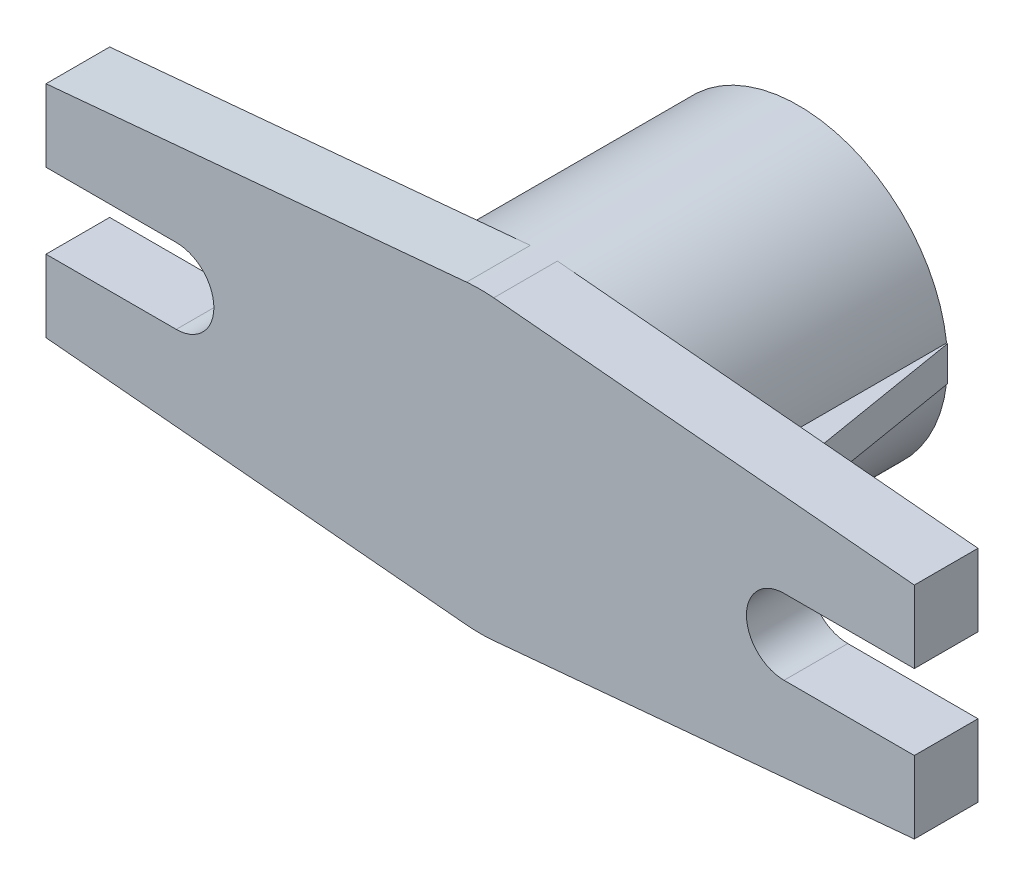
ISO-10303-21;
HEADER;
FILE_DESCRIPTION(('STEP AP214'),'2;1');
FILE_NAME('part.step','',(''),(''),'','','');
FILE_SCHEMA(('AUTOMOTIVE_DESIGN { 1 0 10303 214 1 1 1 1 }'));
ENDSEC;
DATA;
#1=APPLICATION_CONTEXT('core data for automotive mechanical design processes');
#2=APPLICATION_PROTOCOL_DEFINITION('international standard','automotive_design',2000,#1);
#3=PRODUCT_CONTEXT('',#1,'mechanical');
#4=PRODUCT('Part','Part','',(#3));
#5=PRODUCT_RELATED_PRODUCT_CATEGORY('part','',(#4));
#6=PRODUCT_DEFINITION_FORMATION('','',#4);
#7=PRODUCT_DEFINITION_CONTEXT('part definition',#1,'design');
#8=PRODUCT_DEFINITION('design','',#6,#7);
#9=PRODUCT_DEFINITION_SHAPE('','',#8);
#10=(LENGTH_UNIT() NAMED_UNIT(*) SI_UNIT(.MILLI.,.METRE.));
#11=(NAMED_UNIT(*) PLANE_ANGLE_UNIT() SI_UNIT($,.RADIAN.));
#12=(NAMED_UNIT(*) SI_UNIT($,.STERADIAN.) SOLID_ANGLE_UNIT());
#13=UNCERTAINTY_MEASURE_WITH_UNIT(LENGTH_MEASURE(1.E-05),#10,'distance_accuracy_value','');
#14=(GEOMETRIC_REPRESENTATION_CONTEXT(3) GLOBAL_UNCERTAINTY_ASSIGNED_CONTEXT((#13)) GLOBAL_UNIT_ASSIGNED_CONTEXT((#10,
#11,#12)) REPRESENTATION_CONTEXT('',''));
#15=CARTESIAN_POINT('',(0.,0.,0.));
#16=DIRECTION('',(0.,0.,1.));
#17=DIRECTION('',(1.,0.,0.));
#18=AXIS2_PLACEMENT_3D('',#15,#16,#17);
#19=CARTESIAN_POINT('',(0.,0.,110.));
#20=DIRECTION('',(0.,0.,-1.));
#21=DIRECTION('',(-1.,0.,0.));
#22=AXIS2_PLACEMENT_3D('',#19,#20,#21);
#23=CYLINDRICAL_SURFACE('',#22,51.5);
#24=DIRECTION('',(0.,0.,-1.));
#25=VECTOR('',#24,1.);
#26=CARTESIAN_POINT('',(-51.149291295188,-6.,110.));
#27=LINE('',#26,#25);
#28=CARTESIAN_POINT('',(-51.149291295188,-6.,0.));
#29=VERTEX_POINT('',#28);
#30=CARTESIAN_POINT('',(-51.149291295188,-6.,88.));
#31=VERTEX_POINT('',#30);
#32=EDGE_CURVE('E48',#29,#31,#27,.F.);
#33=ORIENTED_EDGE('',*,*,#32,.F.);
#34=CARTESIAN_POINT('',(0.,0.,0.));
#35=DIRECTION('',(0.,0.,1.));
#36=DIRECTION('',(1.,0.,0.));
#37=AXIS2_PLACEMENT_3D('',#34,#35,#36);
#38=CIRCLE('',#37,51.5);
#39=CARTESIAN_POINT('',(51.149291295188,-6.,0.));
#40=VERTEX_POINT('',#39);
#41=EDGE_CURVE('E374',#29,#40,#38,.T.);
#42=ORIENTED_EDGE('',*,*,#41,.T.);
#43=DIRECTION('',(0.,0.,-1.));
#44=VECTOR('',#43,1.);
#45=CARTESIAN_POINT('',(51.149291295188,-6.,110.));
#46=LINE('',#45,#44);
#47=CARTESIAN_POINT('',(51.149291295188,-6.,88.));
#48=VERTEX_POINT('',#47);
#49=EDGE_CURVE('E238',#48,#40,#46,.T.);
#50=ORIENTED_EDGE('',*,*,#49,.F.);
#51=CARTESIAN_POINT('',(0.,0.,88.));
#52=DIRECTION('',(0.,0.,-1.));
#53=DIRECTION('',(-1.,0.,0.));
#54=AXIS2_PLACEMENT_3D('',#51,#52,#53);
#55=CIRCLE('',#54,51.5);
#56=CARTESIAN_POINT('',(4.68919441525604,-51.2860746766209,88.));
#57=VERTEX_POINT('',#56);
#58=EDGE_CURVE('E364',#48,#57,#55,.T.);
#59=ORIENTED_EDGE('',*,*,#58,.T.);
#60=DIRECTION('',(0.,0.,1.));
#61=VECTOR('',#60,1.);
#62=CARTESIAN_POINT('',(4.68919441525604,-51.2860746766209,88.));
#63=LINE('',#62,#61);
#64=CARTESIAN_POINT('',(4.68919441525604,-51.2860746766209,110.));
#65=VERTEX_POINT('',#64);
#66=EDGE_CURVE('E347',#57,#65,#63,.T.);
#67=ORIENTED_EDGE('',*,*,#66,.T.);
#68=CARTESIAN_POINT('',(0.,0.,110.));
#69=DIRECTION('',(0.,0.,1.));
#70=DIRECTION('',(1.,0.,0.));
#71=AXIS2_PLACEMENT_3D('',#68,#69,#70);
#72=CIRCLE('',#71,51.5);
#73=CARTESIAN_POINT('',(-4.68919441525603,-51.2860746766208,110.));
#74=VERTEX_POINT('',#73);
#75=EDGE_CURVE('E379',#74,#65,#72,.T.);
#76=ORIENTED_EDGE('',*,*,#75,.F.);
#77=DIRECTION('',(0.,0.,1.));
#78=VECTOR('',#77,1.);
#79=CARTESIAN_POINT('',(-4.68919441525603,-51.2860746766209,88.));
#80=LINE('',#79,#78);
#81=CARTESIAN_POINT('',(-4.68919441525603,-51.2860746766209,88.));
#82=VERTEX_POINT('',#81);
#83=EDGE_CURVE('E350',#82,#74,#80,.T.);
#84=ORIENTED_EDGE('',*,*,#83,.F.);
#85=EDGE_CURVE('E361',#82,#31,#55,.T.);
#86=ORIENTED_EDGE('',*,*,#85,.T.);
#87=EDGE_LOOP('',(#33,#42,#50,#59,#67,#76,#84,#86));
#88=FACE_BOUND('',#87,.T.);
#89=ADVANCED_FACE('F33',(#88),#23,.T.);
#90=CARTESIAN_POINT('',(0.,0.,66.));
#91=DIRECTION('',(0.,0.,-1.));
#92=DIRECTION('',(-1.,0.,0.));
#93=AXIS2_PLACEMENT_3D('',#90,#91,#92);
#94=CYLINDRICAL_SURFACE('',#93,17.);
#95=CARTESIAN_POINT('',(0.,0.,0.));
#96=DIRECTION('',(0.,0.,1.));
#97=DIRECTION('',(1.,0.,0.));
#98=AXIS2_PLACEMENT_3D('',#95,#96,#97);
#99=CIRCLE('',#98,17.);
#100=CARTESIAN_POINT('',(17.,0.,0.));
#101=VERTEX_POINT('',#100);
#102=EDGE_CURVE('E371',#101,#101,#99,.T.);
#103=ORIENTED_EDGE('',*,*,#102,.F.);
#104=EDGE_LOOP('',(#103));
#105=FACE_BOUND('',#104,.T.);
#106=CARTESIAN_POINT('',(0.,0.,64.));
#107=DIRECTION('',(0.,0.,1.));
#108=DIRECTION('',(1.,0.,0.));
#109=AXIS2_PLACEMENT_3D('',#106,#107,#108);
#110=CIRCLE('',#109,17.);
#111=CARTESIAN_POINT('',(17.,0.,64.));
#112=VERTEX_POINT('',#111);
#113=EDGE_CURVE('E370',#112,#112,#110,.T.);
#114=ORIENTED_EDGE('',*,*,#113,.T.);
#115=EDGE_LOOP('',(#114));
#116=FACE_BOUND('',#115,.T.);
#117=ADVANCED_FACE('F471',(#105,#116),#94,.F.);
#118=CARTESIAN_POINT('',(51.149291295188,6.,0.));
#119=VERTEX_POINT('',#118);
#120=CARTESIAN_POINT('',(-51.149291295188,6.,0.));
#121=VERTEX_POINT('',#120);
#122=EDGE_CURVE('E380',#119,#121,#38,.T.);
#123=ORIENTED_EDGE('',*,*,#122,.T.);
#124=DIRECTION('',(0.,0.,-1.));
#125=VECTOR('',#124,1.);
#126=CARTESIAN_POINT('',(-51.149291295188,6.,110.));
#127=LINE('',#126,#125);
#128=CARTESIAN_POINT('',(-51.149291295188,6.,88.));
#129=VERTEX_POINT('',#128);
#130=EDGE_CURVE('E213',#121,#129,#127,.F.);
#131=ORIENTED_EDGE('',*,*,#130,.T.);
#132=CARTESIAN_POINT('',(-4.68919441525606,51.2860746766209,88.));
#133=VERTEX_POINT('',#132);
#134=EDGE_CURVE('E365',#129,#133,#55,.T.);
#135=ORIENTED_EDGE('',*,*,#134,.T.);
#136=DIRECTION('',(0.,0.,1.));
#137=VECTOR('',#136,1.);
#138=CARTESIAN_POINT('',(-4.68919441525606,51.2860746766209,88.));
#139=LINE('',#138,#137);
#140=CARTESIAN_POINT('',(-4.68919441525606,51.2860746766209,110.));
#141=VERTEX_POINT('',#140);
#142=EDGE_CURVE('E328',#133,#141,#139,.T.);
#143=ORIENTED_EDGE('',*,*,#142,.T.);
#144=CARTESIAN_POINT('',(4.68919441525605,51.2860746766209,110.));
#145=VERTEX_POINT('',#144);
#146=EDGE_CURVE('E375',#145,#141,#72,.T.);
#147=ORIENTED_EDGE('',*,*,#146,.F.);
#148=DIRECTION('',(0.,0.,1.));
#149=VECTOR('',#148,1.);
#150=CARTESIAN_POINT('',(4.68919441525605,51.2860746766208,88.));
#151=LINE('',#150,#149);
#152=CARTESIAN_POINT('',(4.68919441525605,51.2860746766208,88.));
#153=VERTEX_POINT('',#152);
#154=EDGE_CURVE('E331',#153,#145,#151,.T.);
#155=ORIENTED_EDGE('',*,*,#154,.F.);
#156=CARTESIAN_POINT('',(51.149291295188,6.,88.));
#157=VERTEX_POINT('',#156);
#158=EDGE_CURVE('E366',#153,#157,#55,.T.);
#159=ORIENTED_EDGE('',*,*,#158,.T.);
#160=DIRECTION('',(0.,0.,-1.));
#161=VECTOR('',#160,1.);
#162=CARTESIAN_POINT('',(51.149291295188,6.,110.));
#163=LINE('',#162,#161);
#164=EDGE_CURVE('E241',#157,#119,#163,.T.);
#165=ORIENTED_EDGE('',*,*,#164,.T.);
#166=EDGE_LOOP('',(#123,#131,#135,#143,#147,#155,#159,#165));
#167=FACE_BOUND('',#166,.T.);
#168=ADVANCED_FACE('F35',(#167),#23,.T.);
#169=CARTESIAN_POINT('',(0.,0.,110.));
#170=DIRECTION('',(0.,0.,1.));
#171=DIRECTION('',(1.,0.,0.));
#172=AXIS2_PLACEMENT_3D('',#169,#170,#171);
#173=PLANE('',#172);
#174=CARTESIAN_POINT('',(105.,0.,110.));
#175=DIRECTION('',(0.,0.,-1.));
#176=DIRECTION('',(1.,0.,0.));
#177=AXIS2_PLACEMENT_3D('',#174,#175,#176);
#178=CIRCLE('',#177,13.);
#179=CARTESIAN_POINT('',(105.,-13.,110.));
#180=VERTEX_POINT('',#179);
#181=CARTESIAN_POINT('',(105.,13.,110.));
#182=VERTEX_POINT('',#181);
#183=EDGE_CURVE('E308',#180,#182,#178,.T.);
#184=ORIENTED_EDGE('',*,*,#183,.T.);
#185=DIRECTION('',(1.,0.,0.));
#186=VECTOR('',#185,1.);
#187=CARTESIAN_POINT('',(150.,13.,110.));
#188=LINE('',#187,#186);
#189=CARTESIAN_POINT('',(150.,13.,110.));
#190=VERTEX_POINT('',#189);
#191=EDGE_CURVE('E310',#182,#190,#188,.T.);
#192=ORIENTED_EDGE('',*,*,#191,.T.);
#193=DIRECTION('',(0.,1.,0.));
#194=VECTOR('',#193,1.);
#195=CARTESIAN_POINT('',(150.,13.,110.));
#196=LINE('',#195,#194);
#197=CARTESIAN_POINT('',(150.,38.,110.));
#198=VERTEX_POINT('',#197);
#199=EDGE_CURVE('E313',#190,#198,#196,.T.);
#200=ORIENTED_EDGE('',*,*,#199,.T.);
#201=DIRECTION('',(-0.995846110225648,0.0910523187428359,0.));
#202=VECTOR('',#201,1.);
#203=CARTESIAN_POINT('',(150.,38.,110.));
#204=LINE('',#203,#202);
#205=EDGE_CURVE('E316',#198,#145,#204,.T.);
#206=ORIENTED_EDGE('',*,*,#205,.T.);
#207=ORIENTED_EDGE('',*,*,#146,.T.);
#208=DIRECTION('',(-0.995846110225648,-0.0910523187428362,0.));
#209=VECTOR('',#208,1.);
#210=CARTESIAN_POINT('',(-150.,38.,110.));
#211=LINE('',#210,#209);
#212=CARTESIAN_POINT('',(-150.,38.,110.));
#213=VERTEX_POINT('',#212);
#214=EDGE_CURVE('E318',#141,#213,#211,.T.);
#215=ORIENTED_EDGE('',*,*,#214,.T.);
#216=DIRECTION('',(0.,-1.,0.));
#217=VECTOR('',#216,1.);
#218=CARTESIAN_POINT('',(-150.,13.,110.));
#219=LINE('',#218,#217);
#220=CARTESIAN_POINT('',(-150.,13.,110.));
#221=VERTEX_POINT('',#220);
#222=EDGE_CURVE('E249',#213,#221,#219,.T.);
#223=ORIENTED_EDGE('',*,*,#222,.T.);
#224=DIRECTION('',(1.,0.,0.));
#225=VECTOR('',#224,1.);
#226=CARTESIAN_POINT('',(-150.,13.,110.));
#227=LINE('',#226,#225);
#228=CARTESIAN_POINT('',(-105.,13.,110.));
#229=VERTEX_POINT('',#228);
#230=EDGE_CURVE('E244',#221,#229,#227,.T.);
#231=ORIENTED_EDGE('',*,*,#230,.T.);
#232=CARTESIAN_POINT('',(-105.,0.,110.));
#233=DIRECTION('',(0.,0.,-1.));
#234=DIRECTION('',(-1.,0.,0.));
#235=AXIS2_PLACEMENT_3D('',#232,#233,#234);
#236=CIRCLE('',#235,13.);
#237=CARTESIAN_POINT('',(-105.,-13.,110.));
#238=VERTEX_POINT('',#237);
#239=EDGE_CURVE('E289',#229,#238,#236,.T.);
#240=ORIENTED_EDGE('',*,*,#239,.T.);
#241=DIRECTION('',(-1.,0.,0.));
#242=VECTOR('',#241,1.);
#243=CARTESIAN_POINT('',(-105.,-13.,110.));
#244=LINE('',#243,#242);
#245=CARTESIAN_POINT('',(-150.,-13.,110.));
#246=VERTEX_POINT('',#245);
#247=EDGE_CURVE('E291',#238,#246,#244,.T.);
#248=ORIENTED_EDGE('',*,*,#247,.T.);
#249=DIRECTION('',(0.,-1.,0.));
#250=VECTOR('',#249,1.);
#251=CARTESIAN_POINT('',(-150.,-13.,110.));
#252=LINE('',#251,#250);
#253=CARTESIAN_POINT('',(-150.,-38.,110.));
#254=VERTEX_POINT('',#253);
#255=EDGE_CURVE('E294',#246,#254,#252,.T.);
#256=ORIENTED_EDGE('',*,*,#255,.T.);
#257=DIRECTION('',(0.995846110225648,-0.0910523187428356,0.));
#258=VECTOR('',#257,1.);
#259=CARTESIAN_POINT('',(-150.,-38.,110.));
#260=LINE('',#259,#258);
#261=EDGE_CURVE('E297',#254,#74,#260,.T.);
#262=ORIENTED_EDGE('',*,*,#261,.T.);
#263=ORIENTED_EDGE('',*,*,#75,.T.);
#264=DIRECTION('',(0.995846110225648,0.0910523187428357,0.));
#265=VECTOR('',#264,1.);
#266=CARTESIAN_POINT('',(150.,-38.,110.));
#267=LINE('',#266,#265);
#268=CARTESIAN_POINT('',(150.,-38.,110.));
#269=VERTEX_POINT('',#268);
#270=EDGE_CURVE('E299',#65,#269,#267,.T.);
#271=ORIENTED_EDGE('',*,*,#270,.T.);
#272=DIRECTION('',(0.,1.,0.));
#273=VECTOR('',#272,1.);
#274=CARTESIAN_POINT('',(150.,-13.,110.));
#275=LINE('',#274,#273);
#276=CARTESIAN_POINT('',(150.,-13.,110.));
#277=VERTEX_POINT('',#276);
#278=EDGE_CURVE('E302',#269,#277,#275,.T.);
#279=ORIENTED_EDGE('',*,*,#278,.T.);
#280=DIRECTION('',(-1.,0.,0.));
#281=VECTOR('',#280,1.);
#282=CARTESIAN_POINT('',(105.,-13.,110.));
#283=LINE('',#282,#281);
#284=EDGE_CURVE('E305',#277,#180,#283,.T.);
#285=ORIENTED_EDGE('',*,*,#284,.T.);
#286=EDGE_LOOP('',(#184,#192,#200,#206,#207,#215,#223,#231,#240,#248,#256,#262,#263,#271,#279,#285));
#287=FACE_BOUND('',#286,.T.);
#288=ADVANCED_FACE('F427',(#287),#173,.T.);
#289=CARTESIAN_POINT('',(0.,0.,0.));
#290=DIRECTION('',(0.,0.,1.));
#291=DIRECTION('',(1.,0.,0.));
#292=AXIS2_PLACEMENT_3D('',#289,#290,#291);
#293=PLANE('',#292);
#294=ORIENTED_EDGE('',*,*,#102,.T.);
#295=EDGE_LOOP('',(#294));
#296=FACE_BOUND('',#295,.T.);
#297=ORIENTED_EDGE('',*,*,#122,.F.);
#298=DIRECTION('',(1.,0.,0.));
#299=VECTOR('',#298,1.);
#300=CARTESIAN_POINT('',(0.,6.,0.));
#301=LINE('',#300,#299);
#302=CARTESIAN_POINT('',(51.5,6.,0.));
#303=VERTEX_POINT('',#302);
#304=EDGE_CURVE('E227',#119,#303,#301,.T.);
#305=ORIENTED_EDGE('',*,*,#304,.T.);
#306=DIRECTION('',(0.,1.,0.));
#307=VECTOR('',#306,1.);
#308=CARTESIAN_POINT('',(51.5,0.,0.));
#309=LINE('',#308,#307);
#310=CARTESIAN_POINT('',(51.5,-6.,0.));
#311=VERTEX_POINT('',#310);
#312=EDGE_CURVE('E230',#311,#303,#309,.T.);
#313=ORIENTED_EDGE('',*,*,#312,.F.);
#314=DIRECTION('',(1.,0.,0.));
#315=VECTOR('',#314,1.);
#316=CARTESIAN_POINT('',(0.,-6.,0.));
#317=LINE('',#316,#315);
#318=EDGE_CURVE('E234',#40,#311,#317,.T.);
#319=ORIENTED_EDGE('',*,*,#318,.F.);
#320=ORIENTED_EDGE('',*,*,#41,.F.);
#321=DIRECTION('',(1.,0.,0.));
#322=VECTOR('',#321,1.);
#323=CARTESIAN_POINT('',(0.,-6.,0.));
#324=LINE('',#323,#322);
#325=CARTESIAN_POINT('',(-51.5,-6.,0.));
#326=VERTEX_POINT('',#325);
#327=EDGE_CURVE('E200',#29,#326,#324,.F.);
#328=ORIENTED_EDGE('',*,*,#327,.T.);
#329=DIRECTION('',(0.,1.,0.));
#330=VECTOR('',#329,1.);
#331=CARTESIAN_POINT('',(-51.5,0.,0.));
#332=LINE('',#331,#330);
#333=CARTESIAN_POINT('',(-51.5,6.,0.));
#334=VERTEX_POINT('',#333);
#335=EDGE_CURVE('E193',#326,#334,#332,.T.);
#336=ORIENTED_EDGE('',*,*,#335,.T.);
#337=DIRECTION('',(1.,0.,0.));
#338=VECTOR('',#337,1.);
#339=CARTESIAN_POINT('',(0.,6.,0.));
#340=LINE('',#339,#338);
#341=EDGE_CURVE('E197',#121,#334,#340,.F.);
#342=ORIENTED_EDGE('',*,*,#341,.F.);
#343=EDGE_LOOP('',(#297,#305,#313,#319,#320,#328,#336,#342));
#344=FACE_BOUND('',#343,.T.);
#345=ADVANCED_FACE('F196',(#296,#344),#293,.F.);
#346=CARTESIAN_POINT('',(0.,0.,64.));
#347=DIRECTION('',(0.,0.,1.));
#348=DIRECTION('',(1.,0.,0.));
#349=AXIS2_PLACEMENT_3D('',#346,#347,#348);
#350=CYLINDRICAL_SURFACE('',#349,32.);
#351=CARTESIAN_POINT('',(0.,0.,64.));
#352=DIRECTION('',(0.,0.,1.));
#353=DIRECTION('',(1.,0.,0.));
#354=AXIS2_PLACEMENT_3D('',#351,#352,#353);
#355=CIRCLE('',#354,32.);
#356=CARTESIAN_POINT('',(32.,0.,64.));
#357=VERTEX_POINT('',#356);
#358=EDGE_CURVE('E367',#357,#357,#355,.T.);
#359=ORIENTED_EDGE('',*,*,#358,.F.);
#360=EDGE_LOOP('',(#359));
#361=FACE_BOUND('',#360,.T.);
#362=CARTESIAN_POINT('',(0.,0.,88.));
#363=DIRECTION('',(0.,0.,-1.));
#364=DIRECTION('',(-1.,0.,0.));
#365=AXIS2_PLACEMENT_3D('',#362,#363,#364);
#366=CIRCLE('',#365,32.);
#367=CARTESIAN_POINT('',(-32.,0.,88.));
#368=VERTEX_POINT('',#367);
#369=EDGE_CURVE('E325',#368,#368,#366,.F.);
#370=ORIENTED_EDGE('',*,*,#369,.T.);
#371=EDGE_LOOP('',(#370));
#372=FACE_BOUND('',#371,.T.);
#373=ADVANCED_FACE('F485',(#361,#372),#350,.F.);
#374=CARTESIAN_POINT('',(0.,0.,64.));
#375=DIRECTION('',(0.,0.,1.));
#376=DIRECTION('',(1.,0.,0.));
#377=AXIS2_PLACEMENT_3D('',#374,#375,#376);
#378=PLANE('',#377);
#379=ORIENTED_EDGE('',*,*,#113,.F.);
#380=EDGE_LOOP('',(#379));
#381=FACE_BOUND('',#380,.T.);
#382=ORIENTED_EDGE('',*,*,#358,.T.);
#383=EDGE_LOOP('',(#382));
#384=FACE_BOUND('',#383,.T.);
#385=ADVANCED_FACE('F490',(#381,#384),#378,.T.);
#386=CARTESIAN_POINT('',(-105.,0.,88.));
#387=DIRECTION('',(0.,0.,-1.));
#388=DIRECTION('',(-1.,0.,0.));
#389=AXIS2_PLACEMENT_3D('',#386,#387,#388);
#390=PLANE('',#389);
#391=ORIENTED_EDGE('',*,*,#369,.F.);
#392=EDGE_LOOP('',(#391));
#393=FACE_BOUND('',#392,.T.);
#394=ADVANCED_FACE('F494',(#393),#390,.T.);
#395=CARTESIAN_POINT('',(-150.,-13.,88.));
#396=DIRECTION('',(-1.,0.,0.));
#397=DIRECTION('',(0.,0.,1.));
#398=AXIS2_PLACEMENT_3D('',#395,#396,#397);
#399=PLANE('',#398);
#400=ORIENTED_EDGE('',*,*,#255,.F.);
#401=DIRECTION('',(0.,0.,1.));
#402=VECTOR('',#401,1.);
#403=CARTESIAN_POINT('',(-150.,-13.,88.));
#404=LINE('',#403,#402);
#405=CARTESIAN_POINT('',(-150.,-13.,88.));
#406=VERTEX_POINT('',#405);
#407=EDGE_CURVE('E355',#406,#246,#404,.T.);
#408=ORIENTED_EDGE('',*,*,#407,.F.);
#409=DIRECTION('',(0.,-1.,0.));
#410=VECTOR('',#409,1.);
#411=CARTESIAN_POINT('',(-150.,-13.,88.));
#412=LINE('',#411,#410);
#413=CARTESIAN_POINT('',(-150.,-38.,88.));
#414=VERTEX_POINT('',#413);
#415=EDGE_CURVE('E254',#406,#414,#412,.T.);
#416=ORIENTED_EDGE('',*,*,#415,.T.);
#417=DIRECTION('',(0.,0.,1.));
#418=VECTOR('',#417,1.);
#419=CARTESIAN_POINT('',(-150.,-38.,88.));
#420=LINE('',#419,#418);
#421=EDGE_CURVE('E353',#414,#254,#420,.T.);
#422=ORIENTED_EDGE('',*,*,#421,.T.);
#423=EDGE_LOOP('',(#400,#408,#416,#422));
#424=FACE_BOUND('',#423,.T.);
#425=ADVANCED_FACE('F507',(#424),#399,.T.);
#426=CARTESIAN_POINT('',(-105.,-13.,88.));
#427=DIRECTION('',(0.,1.,0.));
#428=DIRECTION('',(0.,0.,1.));
#429=AXIS2_PLACEMENT_3D('',#426,#427,#428);
#430=PLANE('',#429);
#431=ORIENTED_EDGE('',*,*,#247,.F.);
#432=DIRECTION('',(0.,0.,1.));
#433=VECTOR('',#432,1.);
#434=CARTESIAN_POINT('',(-105.,-13.,88.));
#435=LINE('',#434,#433);
#436=CARTESIAN_POINT('',(-105.,-13.,88.));
#437=VERTEX_POINT('',#436);
#438=EDGE_CURVE('E357',#437,#238,#435,.T.);
#439=ORIENTED_EDGE('',*,*,#438,.F.);
#440=DIRECTION('',(-1.,0.,0.));
#441=VECTOR('',#440,1.);
#442=CARTESIAN_POINT('',(-105.,-13.,88.));
#443=LINE('',#442,#441);
#444=EDGE_CURVE('E251',#437,#406,#443,.T.);
#445=ORIENTED_EDGE('',*,*,#444,.T.);
#446=ORIENTED_EDGE('',*,*,#407,.T.);
#447=EDGE_LOOP('',(#431,#439,#445,#446));
#448=FACE_BOUND('',#447,.T.);
#449=ADVANCED_FACE('F503',(#448),#430,.T.);
#450=CARTESIAN_POINT('',(-105.,0.,88.));
#451=DIRECTION('',(0.,0.,1.));
#452=DIRECTION('',(1.,0.,0.));
#453=AXIS2_PLACEMENT_3D('',#450,#451,#452);
#454=CYLINDRICAL_SURFACE('',#453,13.);
#455=CARTESIAN_POINT('',(-105.,0.,88.));
#456=DIRECTION('',(0.,0.,-1.));
#457=DIRECTION('',(-1.,0.,0.));
#458=AXIS2_PLACEMENT_3D('',#455,#456,#457);
#459=CIRCLE('',#458,13.);
#460=CARTESIAN_POINT('',(-105.,13.,88.));
#461=VERTEX_POINT('',#460);
#462=EDGE_CURVE('E248',#461,#437,#459,.T.);
#463=ORIENTED_EDGE('',*,*,#462,.T.);
#464=ORIENTED_EDGE('',*,*,#438,.T.);
#465=ORIENTED_EDGE('',*,*,#239,.F.);
#466=DIRECTION('',(0.,0.,1.));
#467=VECTOR('',#466,1.);
#468=CARTESIAN_POINT('',(-105.,13.,88.));
#469=LINE('',#468,#467);
#470=EDGE_CURVE('E286',#461,#229,#469,.T.);
#471=ORIENTED_EDGE('',*,*,#470,.F.);
#472=EDGE_LOOP('',(#463,#464,#465,#471));
#473=FACE_BOUND('',#472,.T.);
#474=ADVANCED_FACE('F499',(#473),#454,.F.);
#475=CARTESIAN_POINT('',(-150.,13.,88.));
#476=DIRECTION('',(0.,-1.,0.));
#477=DIRECTION('',(0.,0.,-1.));
#478=AXIS2_PLACEMENT_3D('',#475,#476,#477);
#479=PLANE('',#478);
#480=ORIENTED_EDGE('',*,*,#230,.F.);
#481=DIRECTION('',(0.,0.,1.));
#482=VECTOR('',#481,1.);
#483=CARTESIAN_POINT('',(-150.,13.,88.));
#484=LINE('',#483,#482);
#485=CARTESIAN_POINT('',(-150.,13.,88.));
#486=VERTEX_POINT('',#485);
#487=EDGE_CURVE('E323',#486,#221,#484,.T.);
#488=ORIENTED_EDGE('',*,*,#487,.F.);
#489=DIRECTION('',(1.,0.,0.));
#490=VECTOR('',#489,1.);
#491=CARTESIAN_POINT('',(-150.,13.,88.));
#492=LINE('',#491,#490);
#493=EDGE_CURVE('E245',#486,#461,#492,.T.);
#494=ORIENTED_EDGE('',*,*,#493,.T.);
#495=ORIENTED_EDGE('',*,*,#470,.T.);
#496=EDGE_LOOP('',(#480,#488,#494,#495));
#497=FACE_BOUND('',#496,.T.);
#498=ADVANCED_FACE('F496',(#497),#479,.T.);
#499=CARTESIAN_POINT('',(-150.,13.,88.));
#500=DIRECTION('',(-1.,0.,0.));
#501=DIRECTION('',(0.,0.,1.));
#502=AXIS2_PLACEMENT_3D('',#499,#500,#501);
#503=PLANE('',#502);
#504=ORIENTED_EDGE('',*,*,#222,.F.);
#505=DIRECTION('',(0.,0.,1.));
#506=VECTOR('',#505,1.);
#507=CARTESIAN_POINT('',(-150.,38.,88.));
#508=LINE('',#507,#506);
#509=CARTESIAN_POINT('',(-150.,38.,88.));
#510=VERTEX_POINT('',#509);
#511=EDGE_CURVE('E326',#510,#213,#508,.T.);
#512=ORIENTED_EDGE('',*,*,#511,.F.);
#513=DIRECTION('',(0.,-1.,0.));
#514=VECTOR('',#513,1.);
#515=CARTESIAN_POINT('',(-150.,13.,88.));
#516=LINE('',#515,#514);
#517=EDGE_CURVE('E283',#510,#486,#516,.T.);
#518=ORIENTED_EDGE('',*,*,#517,.T.);
#519=ORIENTED_EDGE('',*,*,#487,.T.);
#520=EDGE_LOOP('',(#504,#512,#518,#519));
#521=FACE_BOUND('',#520,.T.);
#522=ADVANCED_FACE('F424',(#521),#503,.T.);
#523=DIRECTION('',(1.,0.,0.));
#524=VECTOR('',#523,1.);
#525=CARTESIAN_POINT('',(-105.,6.,88.));
#526=LINE('',#525,#524);
#527=CARTESIAN_POINT('',(-66.1369054351268,6.,88.));
#528=VERTEX_POINT('',#527);
#529=EDGE_CURVE('E224',#528,#129,#526,.T.);
#530=ORIENTED_EDGE('',*,*,#529,.F.);
#531=DIRECTION('',(0.,1.,0.));
#532=VECTOR('',#531,1.);
#533=CARTESIAN_POINT('',(-66.1369054351268,0.,88.));
#534=LINE('',#533,#532);
#535=CARTESIAN_POINT('',(-66.1369054351268,-6.,88.));
#536=VERTEX_POINT('',#535);
#537=EDGE_CURVE('E11',#536,#528,#534,.T.);
#538=ORIENTED_EDGE('',*,*,#537,.F.);
#539=DIRECTION('',(1.,0.,0.));
#540=VECTOR('',#539,1.);
#541=CARTESIAN_POINT('',(-105.,-6.,88.));
#542=LINE('',#541,#540);
#543=EDGE_CURVE('E205',#536,#31,#542,.T.);
#544=ORIENTED_EDGE('',*,*,#543,.T.);
#545=ORIENTED_EDGE('',*,*,#85,.F.);
#546=DIRECTION('',(0.995846110225648,-0.0910523187428356,0.));
#547=VECTOR('',#546,1.);
#548=CARTESIAN_POINT('',(-150.,-38.,88.));
#549=LINE('',#548,#547);
#550=EDGE_CURVE('E257',#414,#82,#549,.T.);
#551=ORIENTED_EDGE('',*,*,#550,.F.);
#552=ORIENTED_EDGE('',*,*,#415,.F.);
#553=ORIENTED_EDGE('',*,*,#444,.F.);
#554=ORIENTED_EDGE('',*,*,#462,.F.);
#555=ORIENTED_EDGE('',*,*,#493,.F.);
#556=ORIENTED_EDGE('',*,*,#517,.F.);
#557=DIRECTION('',(-0.995846110225648,-0.0910523187428362,0.));
#558=VECTOR('',#557,1.);
#559=CARTESIAN_POINT('',(-150.,38.,88.));
#560=LINE('',#559,#558);
#561=EDGE_CURVE('E280',#133,#510,#560,.T.);
#562=ORIENTED_EDGE('',*,*,#561,.F.);
#563=ORIENTED_EDGE('',*,*,#134,.F.);
#564=EDGE_LOOP('',(#530,#538,#544,#545,#551,#552,#553,#554,#555,#556,#562,#563));
#565=FACE_BOUND('',#564,.T.);
#566=ADVANCED_FACE('F419',(#565),#390,.T.);
#567=CARTESIAN_POINT('',(-150.,-38.,88.));
#568=DIRECTION('',(-0.0910523187428356,-0.995846110225648,0.));
#569=DIRECTION('',(0.995846110225648,-0.0910523187428356,0.));
#570=AXIS2_PLACEMENT_3D('',#567,#568,#569);
#571=PLANE('',#570);
#572=ORIENTED_EDGE('',*,*,#261,.F.);
#573=ORIENTED_EDGE('',*,*,#421,.F.);
#574=ORIENTED_EDGE('',*,*,#550,.T.);
#575=ORIENTED_EDGE('',*,*,#83,.T.);
#576=EDGE_LOOP('',(#572,#573,#574,#575));
#577=FACE_BOUND('',#576,.T.);
#578=ADVANCED_FACE('F458',(#577),#571,.T.);
#579=CARTESIAN_POINT('',(-150.,38.,88.));
#580=DIRECTION('',(-0.0910523187428362,0.995846110225648,0.));
#581=DIRECTION('',(-0.995846110225648,-0.0910523187428362,0.));
#582=AXIS2_PLACEMENT_3D('',#579,#580,#581);
#583=PLANE('',#582);
#584=ORIENTED_EDGE('',*,*,#214,.F.);
#585=ORIENTED_EDGE('',*,*,#142,.F.);
#586=ORIENTED_EDGE('',*,*,#561,.T.);
#587=ORIENTED_EDGE('',*,*,#511,.T.);
#588=EDGE_LOOP('',(#584,#585,#586,#587));
#589=FACE_BOUND('',#588,.T.);
#590=ADVANCED_FACE('F417',(#589),#583,.T.);
#591=DIRECTION('',(1.,0.,0.));
#592=VECTOR('',#591,1.);
#593=CARTESIAN_POINT('',(150.,13.,88.));
#594=LINE('',#593,#592);
#595=CARTESIAN_POINT('',(105.,13.,88.));
#596=VERTEX_POINT('',#595);
#597=CARTESIAN_POINT('',(150.,13.,88.));
#598=VERTEX_POINT('',#597);
#599=EDGE_CURVE('E271',#596,#598,#594,.T.);
#600=ORIENTED_EDGE('',*,*,#599,.F.);
#601=CARTESIAN_POINT('',(105.,0.,88.));
#602=DIRECTION('',(0.,0.,-1.));
#603=DIRECTION('',(1.,0.,0.));
#604=AXIS2_PLACEMENT_3D('',#601,#602,#603);
#605=CIRCLE('',#604,13.);
#606=CARTESIAN_POINT('',(105.,-13.,88.));
#607=VERTEX_POINT('',#606);
#608=EDGE_CURVE('E269',#607,#596,#605,.T.);
#609=ORIENTED_EDGE('',*,*,#608,.F.);
#610=DIRECTION('',(-1.,0.,0.));
#611=VECTOR('',#610,1.);
#612=CARTESIAN_POINT('',(105.,-13.,88.));
#613=LINE('',#612,#611);
#614=CARTESIAN_POINT('',(150.,-13.,88.));
#615=VERTEX_POINT('',#614);
#616=EDGE_CURVE('E266',#615,#607,#613,.T.);
#617=ORIENTED_EDGE('',*,*,#616,.F.);
#618=DIRECTION('',(0.,1.,0.));
#619=VECTOR('',#618,1.);
#620=CARTESIAN_POINT('',(150.,-13.,88.));
#621=LINE('',#620,#619);
#622=CARTESIAN_POINT('',(150.,-38.,88.));
#623=VERTEX_POINT('',#622);
#624=EDGE_CURVE('E263',#623,#615,#621,.T.);
#625=ORIENTED_EDGE('',*,*,#624,.F.);
#626=DIRECTION('',(0.995846110225648,0.0910523187428357,0.));
#627=VECTOR('',#626,1.);
#628=CARTESIAN_POINT('',(150.,-38.,88.));
#629=LINE('',#628,#627);
#630=EDGE_CURVE('E260',#57,#623,#629,.T.);
#631=ORIENTED_EDGE('',*,*,#630,.F.);
#632=ORIENTED_EDGE('',*,*,#58,.F.);
#633=DIRECTION('',(1.,0.,0.));
#634=VECTOR('',#633,1.);
#635=CARTESIAN_POINT('',(-105.,-6.,88.));
#636=LINE('',#635,#634);
#637=CARTESIAN_POINT('',(66.1369054351268,-6.,88.));
#638=VERTEX_POINT('',#637);
#639=EDGE_CURVE('E378',#48,#638,#636,.T.);
#640=ORIENTED_EDGE('',*,*,#639,.T.);
#641=DIRECTION('',(0.,1.,0.));
#642=VECTOR('',#641,1.);
#643=CARTESIAN_POINT('',(66.1369054351267,0.,88.));
#644=LINE('',#643,#642);
#645=CARTESIAN_POINT('',(66.1369054351268,6.,88.));
#646=VERTEX_POINT('',#645);
#647=EDGE_CURVE('E388',#646,#638,#644,.F.);
#648=ORIENTED_EDGE('',*,*,#647,.F.);
#649=DIRECTION('',(1.,0.,0.));
#650=VECTOR('',#649,1.);
#651=CARTESIAN_POINT('',(-105.,6.,88.));
#652=LINE('',#651,#650);
#653=EDGE_CURVE('E41',#157,#646,#652,.T.);
#654=ORIENTED_EDGE('',*,*,#653,.F.);
#655=ORIENTED_EDGE('',*,*,#158,.F.);
#656=DIRECTION('',(-0.995846110225648,0.0910523187428359,0.));
#657=VECTOR('',#656,1.);
#658=CARTESIAN_POINT('',(150.,38.,88.));
#659=LINE('',#658,#657);
#660=CARTESIAN_POINT('',(150.,38.,88.));
#661=VERTEX_POINT('',#660);
#662=EDGE_CURVE('E277',#661,#153,#659,.T.);
#663=ORIENTED_EDGE('',*,*,#662,.F.);
#664=DIRECTION('',(0.,1.,0.));
#665=VECTOR('',#664,1.);
#666=CARTESIAN_POINT('',(150.,13.,88.));
#667=LINE('',#666,#665);
#668=EDGE_CURVE('E274',#598,#661,#667,.T.);
#669=ORIENTED_EDGE('',*,*,#668,.F.);
#670=EDGE_LOOP('',(#600,#609,#617,#625,#631,#632,#640,#648,#654,#655,#663,#669));
#671=FACE_BOUND('',#670,.T.);
#672=ADVANCED_FACE('F400',(#671),#390,.T.);
#673=CARTESIAN_POINT('',(150.,38.,88.));
#674=DIRECTION('',(0.0910523187428359,0.995846110225648,0.));
#675=DIRECTION('',(-0.995846110225648,0.0910523187428359,0.));
#676=AXIS2_PLACEMENT_3D('',#673,#674,#675);
#677=PLANE('',#676);
#678=ORIENTED_EDGE('',*,*,#205,.F.);
#679=DIRECTION('',(0.,0.,1.));
#680=VECTOR('',#679,1.);
#681=CARTESIAN_POINT('',(150.,38.,88.));
#682=LINE('',#681,#680);
#683=EDGE_CURVE('E334',#661,#198,#682,.T.);
#684=ORIENTED_EDGE('',*,*,#683,.F.);
#685=ORIENTED_EDGE('',*,*,#662,.T.);
#686=ORIENTED_EDGE('',*,*,#154,.T.);
#687=EDGE_LOOP('',(#678,#684,#685,#686));
#688=FACE_BOUND('',#687,.T.);
#689=ADVANCED_FACE('F431',(#688),#677,.T.);
#690=CARTESIAN_POINT('',(150.,13.,88.));
#691=DIRECTION('',(1.,0.,0.));
#692=DIRECTION('',(0.,0.,-1.));
#693=AXIS2_PLACEMENT_3D('',#690,#691,#692);
#694=PLANE('',#693);
#695=ORIENTED_EDGE('',*,*,#199,.F.);
#696=DIRECTION('',(0.,0.,1.));
#697=VECTOR('',#696,1.);
#698=CARTESIAN_POINT('',(150.,13.,88.));
#699=LINE('',#698,#697);
#700=EDGE_CURVE('E336',#598,#190,#699,.T.);
#701=ORIENTED_EDGE('',*,*,#700,.F.);
#702=ORIENTED_EDGE('',*,*,#668,.T.);
#703=ORIENTED_EDGE('',*,*,#683,.T.);
#704=EDGE_LOOP('',(#695,#701,#702,#703));
#705=FACE_BOUND('',#704,.T.);
#706=ADVANCED_FACE('F434',(#705),#694,.T.);
#707=CARTESIAN_POINT('',(150.,13.,88.));
#708=DIRECTION('',(0.,-1.,0.));
#709=DIRECTION('',(1.,0.,0.));
#710=AXIS2_PLACEMENT_3D('',#707,#708,#709);
#711=PLANE('',#710);
#712=ORIENTED_EDGE('',*,*,#191,.F.);
#713=DIRECTION('',(0.,0.,1.));
#714=VECTOR('',#713,1.);
#715=CARTESIAN_POINT('',(105.,13.,88.));
#716=LINE('',#715,#714);
#717=EDGE_CURVE('E338',#596,#182,#716,.T.);
#718=ORIENTED_EDGE('',*,*,#717,.F.);
#719=ORIENTED_EDGE('',*,*,#599,.T.);
#720=ORIENTED_EDGE('',*,*,#700,.T.);
#721=EDGE_LOOP('',(#712,#718,#719,#720));
#722=FACE_BOUND('',#721,.T.);
#723=ADVANCED_FACE('F437',(#722),#711,.T.);
#724=CARTESIAN_POINT('',(105.,0.,88.));
#725=DIRECTION('',(0.,0.,1.));
#726=DIRECTION('',(1.,0.,0.));
#727=AXIS2_PLACEMENT_3D('',#724,#725,#726);
#728=CYLINDRICAL_SURFACE('',#727,13.);
#729=ORIENTED_EDGE('',*,*,#717,.T.);
#730=ORIENTED_EDGE('',*,*,#183,.F.);
#731=DIRECTION('',(0.,0.,1.));
#732=VECTOR('',#731,1.);
#733=CARTESIAN_POINT('',(105.,-13.,88.));
#734=LINE('',#733,#732);
#735=EDGE_CURVE('E341',#607,#180,#734,.T.);
#736=ORIENTED_EDGE('',*,*,#735,.F.);
#737=ORIENTED_EDGE('',*,*,#608,.T.);
#738=EDGE_LOOP('',(#729,#730,#736,#737));
#739=FACE_BOUND('',#738,.T.);
#740=ADVANCED_FACE('F520',(#739),#728,.F.);
#741=CARTESIAN_POINT('',(105.,-13.,88.));
#742=DIRECTION('',(0.,1.,0.));
#743=DIRECTION('',(0.,0.,1.));
#744=AXIS2_PLACEMENT_3D('',#741,#742,#743);
#745=PLANE('',#744);
#746=ORIENTED_EDGE('',*,*,#284,.F.);
#747=DIRECTION('',(0.,0.,1.));
#748=VECTOR('',#747,1.);
#749=CARTESIAN_POINT('',(150.,-13.,88.));
#750=LINE('',#749,#748);
#751=EDGE_CURVE('E343',#615,#277,#750,.T.);
#752=ORIENTED_EDGE('',*,*,#751,.F.);
#753=ORIENTED_EDGE('',*,*,#616,.T.);
#754=ORIENTED_EDGE('',*,*,#735,.T.);
#755=EDGE_LOOP('',(#746,#752,#753,#754));
#756=FACE_BOUND('',#755,.T.);
#757=ADVANCED_FACE('F445',(#756),#745,.T.);
#758=CARTESIAN_POINT('',(150.,-13.,88.));
#759=DIRECTION('',(1.,0.,0.));
#760=DIRECTION('',(0.,0.,-1.));
#761=AXIS2_PLACEMENT_3D('',#758,#759,#760);
#762=PLANE('',#761);
#763=ORIENTED_EDGE('',*,*,#278,.F.);
#764=DIRECTION('',(0.,0.,1.));
#765=VECTOR('',#764,1.);
#766=CARTESIAN_POINT('',(150.,-38.,88.));
#767=LINE('',#766,#765);
#768=EDGE_CURVE('E345',#623,#269,#767,.T.);
#769=ORIENTED_EDGE('',*,*,#768,.F.);
#770=ORIENTED_EDGE('',*,*,#624,.T.);
#771=ORIENTED_EDGE('',*,*,#751,.T.);
#772=EDGE_LOOP('',(#763,#769,#770,#771));
#773=FACE_BOUND('',#772,.T.);
#774=ADVANCED_FACE('F449',(#773),#762,.T.);
#775=CARTESIAN_POINT('',(150.,-38.,88.));
#776=DIRECTION('',(0.0910523187428357,-0.995846110225648,0.));
#777=DIRECTION('',(0.995846110225648,0.0910523187428357,0.));
#778=AXIS2_PLACEMENT_3D('',#775,#776,#777);
#779=PLANE('',#778);
#780=ORIENTED_EDGE('',*,*,#270,.F.);
#781=ORIENTED_EDGE('',*,*,#66,.F.);
#782=ORIENTED_EDGE('',*,*,#630,.T.);
#783=ORIENTED_EDGE('',*,*,#768,.T.);
#784=EDGE_LOOP('',(#780,#781,#782,#783));
#785=FACE_BOUND('',#784,.T.);
#786=ADVANCED_FACE('F451',(#785),#779,.T.);
#787=CARTESIAN_POINT('',(0.,6.,55.));
#788=DIRECTION('',(0.,1.,0.));
#789=DIRECTION('',(0.,0.,1.));
#790=AXIS2_PLACEMENT_3D('',#787,#788,#789);
#791=PLANE('',#790);
#792=ORIENTED_EDGE('',*,*,#164,.F.);
#793=ORIENTED_EDGE('',*,*,#653,.T.);
#794=DIRECTION('',(0.16407438238699,0.,0.986447969760356));
#795=VECTOR('',#794,1.);
#796=CARTESIAN_POINT('',(51.5,6.,0.));
#797=LINE('',#796,#795);
#798=EDGE_CURVE('E231',#303,#646,#797,.T.);
#799=ORIENTED_EDGE('',*,*,#798,.F.);
#800=ORIENTED_EDGE('',*,*,#304,.F.);
#801=EDGE_LOOP('',(#792,#793,#799,#800));
#802=FACE_BOUND('',#801,.T.);
#803=ADVANCED_FACE('F392',(#802),#791,.T.);
#804=CARTESIAN_POINT('',(0.,-6.,55.));
#805=DIRECTION('',(0.,1.,0.));
#806=DIRECTION('',(0.,0.,1.));
#807=AXIS2_PLACEMENT_3D('',#804,#805,#806);
#808=PLANE('',#807);
#809=ORIENTED_EDGE('',*,*,#639,.F.);
#810=ORIENTED_EDGE('',*,*,#49,.T.);
#811=ORIENTED_EDGE('',*,*,#318,.T.);
#812=DIRECTION('',(0.16407438238699,0.,0.986447969760356));
#813=VECTOR('',#812,1.);
#814=CARTESIAN_POINT('',(51.5,-6.,0.));
#815=LINE('',#814,#813);
#816=EDGE_CURVE('E56',#311,#638,#815,.T.);
#817=ORIENTED_EDGE('',*,*,#816,.T.);
#818=EDGE_LOOP('',(#809,#810,#811,#817));
#819=FACE_BOUND('',#818,.T.);
#820=ADVANCED_FACE('F404',(#819),#808,.F.);
#821=CARTESIAN_POINT('',(51.5,0.,0.));
#822=DIRECTION('',(-0.986447969760356,0.,0.16407438238699));
#823=DIRECTION('',(0.16407438238699,0.,0.986447969760356));
#824=AXIS2_PLACEMENT_3D('',#821,#822,#823);
#825=PLANE('',#824);
#826=ORIENTED_EDGE('',*,*,#798,.T.);
#827=ORIENTED_EDGE('',*,*,#647,.T.);
#828=ORIENTED_EDGE('',*,*,#816,.F.);
#829=ORIENTED_EDGE('',*,*,#312,.T.);
#830=EDGE_LOOP('',(#826,#827,#828,#829));
#831=FACE_BOUND('',#830,.T.);
#832=ADVANCED_FACE('F397',(#831),#825,.F.);
#833=CARTESIAN_POINT('',(0.,6.,55.));
#834=DIRECTION('',(0.,1.,0.));
#835=DIRECTION('',(0.,0.,1.));
#836=AXIS2_PLACEMENT_3D('',#833,#834,#835);
#837=PLANE('',#836);
#838=ORIENTED_EDGE('',*,*,#130,.F.);
#839=ORIENTED_EDGE('',*,*,#341,.T.);
#840=DIRECTION('',(-0.16407438238699,0.,0.986447969760356));
#841=VECTOR('',#840,1.);
#842=CARTESIAN_POINT('',(-51.5,6.,0.));
#843=LINE('',#842,#841);
#844=EDGE_CURVE('E210',#334,#528,#843,.T.);
#845=ORIENTED_EDGE('',*,*,#844,.T.);
#846=ORIENTED_EDGE('',*,*,#529,.T.);
#847=EDGE_LOOP('',(#838,#839,#845,#846));
#848=FACE_BOUND('',#847,.T.);
#849=ADVANCED_FACE('F209',(#848),#837,.T.);
#850=CARTESIAN_POINT('',(0.,-6.,55.));
#851=DIRECTION('',(0.,1.,0.));
#852=DIRECTION('',(0.,0.,1.));
#853=AXIS2_PLACEMENT_3D('',#850,#851,#852);
#854=PLANE('',#853);
#855=ORIENTED_EDGE('',*,*,#327,.F.);
#856=ORIENTED_EDGE('',*,*,#32,.T.);
#857=ORIENTED_EDGE('',*,*,#543,.F.);
#858=DIRECTION('',(-0.16407438238699,0.,0.986447969760356));
#859=VECTOR('',#858,1.);
#860=CARTESIAN_POINT('',(-51.5,-6.,0.));
#861=LINE('',#860,#859);
#862=EDGE_CURVE('E218',#326,#536,#861,.T.);
#863=ORIENTED_EDGE('',*,*,#862,.F.);
#864=EDGE_LOOP('',(#855,#856,#857,#863));
#865=FACE_BOUND('',#864,.T.);
#866=ADVANCED_FACE('F461',(#865),#854,.F.);
#867=CARTESIAN_POINT('',(-51.5,0.,0.));
#868=DIRECTION('',(-0.986447969760356,0.,-0.16407438238699));
#869=DIRECTION('',(-0.16407438238699,0.,0.986447969760356));
#870=AXIS2_PLACEMENT_3D('',#867,#868,#869);
#871=PLANE('',#870);
#872=ORIENTED_EDGE('',*,*,#862,.T.);
#873=ORIENTED_EDGE('',*,*,#537,.T.);
#874=ORIENTED_EDGE('',*,*,#844,.F.);
#875=ORIENTED_EDGE('',*,*,#335,.F.);
#876=EDGE_LOOP('',(#872,#873,#874,#875));
#877=FACE_BOUND('',#876,.T.);
#878=ADVANCED_FACE('F215',(#877),#871,.T.);
#879=CLOSED_SHELL('',(#89,#117,#168,#288,#345,#373,#385,#394,#425,#449,#474,#498,#522,#566,#578,
#590,#672,#689,#706,#723,#740,#757,#774,#786,#803,#820,#832,#849,#866,#878));
#880=MANIFOLD_SOLID_BREP('B2',#879);
#881=ADVANCED_BREP_SHAPE_REPRESENTATION('',(#18,#880),#14);
#882=SHAPE_DEFINITION_REPRESENTATION(#9,#881);
ENDSEC;
END-ISO-10303-21;
